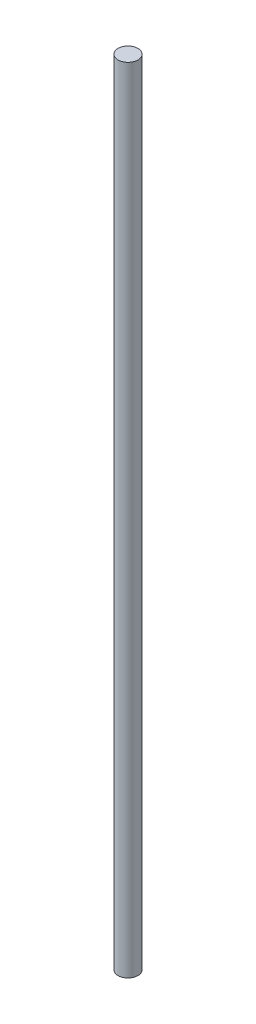
ISO-10303-21;
HEADER;
FILE_DESCRIPTION(('STEP AP214'),'2;1');
FILE_NAME('part.step','',(''),(''),'','','');
FILE_SCHEMA(('AUTOMOTIVE_DESIGN { 1 0 10303 214 1 1 1 1 }'));
ENDSEC;
DATA;
#1=APPLICATION_CONTEXT('core data for automotive mechanical design processes');
#2=APPLICATION_PROTOCOL_DEFINITION('international standard','automotive_design',2000,#1);
#3=PRODUCT_CONTEXT('',#1,'mechanical');
#4=PRODUCT('Part','Part','',(#3));
#5=PRODUCT_RELATED_PRODUCT_CATEGORY('part','',(#4));
#6=PRODUCT_DEFINITION_FORMATION('','',#4);
#7=PRODUCT_DEFINITION_CONTEXT('part definition',#1,'design');
#8=PRODUCT_DEFINITION('design','',#6,#7);
#9=PRODUCT_DEFINITION_SHAPE('','',#8);
#10=(LENGTH_UNIT() NAMED_UNIT(*) SI_UNIT(.MILLI.,.METRE.));
#11=(NAMED_UNIT(*) PLANE_ANGLE_UNIT() SI_UNIT($,.RADIAN.));
#12=(NAMED_UNIT(*) SI_UNIT($,.STERADIAN.) SOLID_ANGLE_UNIT());
#13=UNCERTAINTY_MEASURE_WITH_UNIT(LENGTH_MEASURE(1.E-05),#10,'distance_accuracy_value','');
#14=(GEOMETRIC_REPRESENTATION_CONTEXT(3) GLOBAL_UNCERTAINTY_ASSIGNED_CONTEXT((#13)) GLOBAL_UNIT_ASSIGNED_CONTEXT((#10,
#11,#12)) REPRESENTATION_CONTEXT('',''));
#15=CARTESIAN_POINT('',(0.,0.,0.));
#16=DIRECTION('',(0.,0.,1.));
#17=DIRECTION('',(1.,0.,0.));
#18=AXIS2_PLACEMENT_3D('',#15,#16,#17);
#19=CARTESIAN_POINT('',(0.,111.,0.));
#20=DIRECTION('',(0.,-1.,0.));
#21=DIRECTION('',(0.,0.,-1.));
#22=AXIS2_PLACEMENT_3D('',#19,#20,#21);
#23=CYLINDRICAL_SURFACE('',#22,1.4);
#24=CARTESIAN_POINT('',(0.,111.,0.));
#25=DIRECTION('',(0.,1.,0.));
#26=DIRECTION('',(0.,0.,1.));
#27=AXIS2_PLACEMENT_3D('',#24,#25,#26);
#28=CIRCLE('',#27,1.4);
#29=CARTESIAN_POINT('',(0.,111.,1.4));
#30=VERTEX_POINT('',#29);
#31=EDGE_CURVE('E10',#30,#30,#28,.T.);
#32=ORIENTED_EDGE('',*,*,#31,.F.);
#33=EDGE_LOOP('',(#32));
#34=FACE_BOUND('',#33,.T.);
#35=CARTESIAN_POINT('',(0.,0.,0.));
#36=DIRECTION('',(0.,1.,0.));
#37=DIRECTION('',(0.,0.,1.));
#38=AXIS2_PLACEMENT_3D('',#35,#36,#37);
#39=CIRCLE('',#38,1.4);
#40=CARTESIAN_POINT('',(0.,0.,1.4));
#41=VERTEX_POINT('',#40);
#42=EDGE_CURVE('E33',#41,#41,#39,.T.);
#43=ORIENTED_EDGE('',*,*,#42,.T.);
#44=EDGE_LOOP('',(#43));
#45=FACE_BOUND('',#44,.T.);
#46=ADVANCED_FACE('F30',(#34,#45),#23,.T.);
#47=CARTESIAN_POINT('',(0.,111.,0.));
#48=DIRECTION('',(0.,1.,0.));
#49=DIRECTION('',(0.,0.,1.));
#50=AXIS2_PLACEMENT_3D('',#47,#48,#49);
#51=PLANE('',#50);
#52=ORIENTED_EDGE('',*,*,#31,.T.);
#53=EDGE_LOOP('',(#52));
#54=FACE_BOUND('',#53,.T.);
#55=ADVANCED_FACE('F45',(#54),#51,.T.);
#56=CARTESIAN_POINT('',(0.,0.,0.));
#57=DIRECTION('',(0.,1.,0.));
#58=DIRECTION('',(0.,0.,1.));
#59=AXIS2_PLACEMENT_3D('',#56,#57,#58);
#60=PLANE('',#59);
#61=ORIENTED_EDGE('',*,*,#42,.F.);
#62=EDGE_LOOP('',(#61));
#63=FACE_BOUND('',#62,.T.);
#64=ADVANCED_FACE('F43',(#63),#60,.F.);
#65=CLOSED_SHELL('',(#46,#55,#64));
#66=MANIFOLD_SOLID_BREP('B2',#65);
#67=ADVANCED_BREP_SHAPE_REPRESENTATION('',(#18,#66),#14);
#68=SHAPE_DEFINITION_REPRESENTATION(#9,#67);
ENDSEC;
END-ISO-10303-21;
